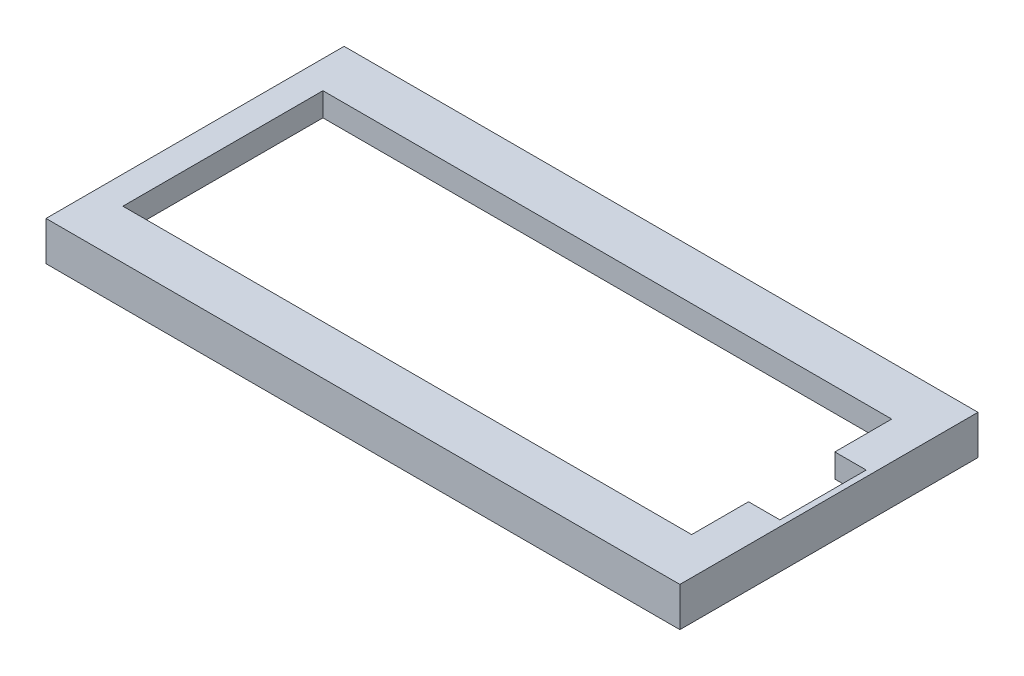
ISO-10303-21;
HEADER;
FILE_DESCRIPTION(('STEP AP214'),'2;1');
FILE_NAME('part.step','',(''),(''),'','','');
FILE_SCHEMA(('AUTOMOTIVE_DESIGN { 1 0 10303 214 1 1 1 1 }'));
ENDSEC;
DATA;
#1=APPLICATION_CONTEXT('core data for automotive mechanical design processes');
#2=APPLICATION_PROTOCOL_DEFINITION('international standard','automotive_design',2000,#1);
#3=PRODUCT_CONTEXT('',#1,'mechanical');
#4=PRODUCT('Part','Part','',(#3));
#5=PRODUCT_RELATED_PRODUCT_CATEGORY('part','',(#4));
#6=PRODUCT_DEFINITION_FORMATION('','',#4);
#7=PRODUCT_DEFINITION_CONTEXT('part definition',#1,'design');
#8=PRODUCT_DEFINITION('design','',#6,#7);
#9=PRODUCT_DEFINITION_SHAPE('','',#8);
#10=(LENGTH_UNIT() NAMED_UNIT(*) SI_UNIT(.MILLI.,.METRE.));
#11=(NAMED_UNIT(*) PLANE_ANGLE_UNIT() SI_UNIT($,.RADIAN.));
#12=(NAMED_UNIT(*) SI_UNIT($,.STERADIAN.) SOLID_ANGLE_UNIT());
#13=UNCERTAINTY_MEASURE_WITH_UNIT(LENGTH_MEASURE(1.E-05),#10,'distance_accuracy_value','');
#14=(GEOMETRIC_REPRESENTATION_CONTEXT(3) GLOBAL_UNCERTAINTY_ASSIGNED_CONTEXT((#13)) GLOBAL_UNIT_ASSIGNED_CONTEXT((#10,
#11,#12)) REPRESENTATION_CONTEXT('',''));
#15=CARTESIAN_POINT('',(0.,0.,0.));
#16=DIRECTION('',(0.,0.,1.));
#17=DIRECTION('',(1.,0.,0.));
#18=AXIS2_PLACEMENT_3D('',#15,#16,#17);
#19=CARTESIAN_POINT('',(0.,-2.,0.));
#20=DIRECTION('',(0.,1.,0.));
#21=DIRECTION('',(0.,0.,1.));
#22=AXIS2_PLACEMENT_3D('',#19,#20,#21);
#23=PLANE('',#22);
#24=DIRECTION('',(1.,0.,0.));
#25=VECTOR('',#24,1.);
#26=CARTESIAN_POINT('',(41.,-2.,19.));
#27=LINE('',#26,#25);
#28=CARTESIAN_POINT('',(-39.8,-2.,19.));
#29=VERTEX_POINT('',#28);
#30=CARTESIAN_POINT('',(41.,-2.,19.));
#31=VERTEX_POINT('',#30);
#32=EDGE_CURVE('E212',#29,#31,#27,.T.);
#33=ORIENTED_EDGE('',*,*,#32,.F.);
#34=DIRECTION('',(0.,0.,1.));
#35=VECTOR('',#34,1.);
#36=CARTESIAN_POINT('',(-39.8,-2.,-19.));
#37=LINE('',#36,#35);
#38=CARTESIAN_POINT('',(-39.8,-2.,18.25));
#39=VERTEX_POINT('',#38);
#40=EDGE_CURVE('E190',#39,#29,#37,.T.);
#41=ORIENTED_EDGE('',*,*,#40,.F.);
#42=DIRECTION('',(1.,0.,0.));
#43=VECTOR('',#42,1.);
#44=CARTESIAN_POINT('',(40.25,-2.,18.25));
#45=LINE('',#44,#43);
#46=CARTESIAN_POINT('',(40.25,-2.,18.25));
#47=VERTEX_POINT('',#46);
#48=EDGE_CURVE('E317',#39,#47,#45,.T.);
#49=ORIENTED_EDGE('',*,*,#48,.T.);
#50=DIRECTION('',(0.,0.,-1.));
#51=VECTOR('',#50,1.);
#52=CARTESIAN_POINT('',(40.25,-2.,18.25));
#53=LINE('',#52,#51);
#54=CARTESIAN_POINT('',(40.25,-2.,-18.25));
#55=VERTEX_POINT('',#54);
#56=EDGE_CURVE('E346',#47,#55,#53,.T.);
#57=ORIENTED_EDGE('',*,*,#56,.T.);
#58=DIRECTION('',(-1.,0.,0.));
#59=VECTOR('',#58,1.);
#60=CARTESIAN_POINT('',(40.25,-2.,-18.25));
#61=LINE('',#60,#59);
#62=CARTESIAN_POINT('',(6.00000000000001,-2.,-18.25));
#63=VERTEX_POINT('',#62);
#64=EDGE_CURVE('E335',#55,#63,#61,.T.);
#65=ORIENTED_EDGE('',*,*,#64,.T.);
#66=DIRECTION('',(0.,0.,1.));
#67=VECTOR('',#66,1.);
#68=CARTESIAN_POINT('',(6.00000000000001,-2.,-14.25));
#69=LINE('',#68,#67);
#70=CARTESIAN_POINT('',(6.00000000000001,-2.,-19.));
#71=VERTEX_POINT('',#70);
#72=EDGE_CURVE('E55',#71,#63,#69,.T.);
#73=ORIENTED_EDGE('',*,*,#72,.F.);
#74=DIRECTION('',(-1.,0.,0.));
#75=VECTOR('',#74,1.);
#76=CARTESIAN_POINT('',(41.,-2.,-19.));
#77=LINE('',#76,#75);
#78=CARTESIAN_POINT('',(41.,-2.,-19.));
#79=VERTEX_POINT('',#78);
#80=EDGE_CURVE('E206',#79,#71,#77,.T.);
#81=ORIENTED_EDGE('',*,*,#80,.F.);
#82=DIRECTION('',(0.,0.,-1.));
#83=VECTOR('',#82,1.);
#84=CARTESIAN_POINT('',(41.,-2.,19.));
#85=LINE('',#84,#83);
#86=EDGE_CURVE('E207',#31,#79,#85,.T.);
#87=ORIENTED_EDGE('',*,*,#86,.F.);
#88=EDGE_LOOP('',(#33,#41,#49,#57,#65,#73,#81,#87));
#89=FACE_BOUND('',#88,.T.);
#90=ADVANCED_FACE('F33',(#89),#23,.F.);
#91=CARTESIAN_POINT('',(41.5549280455494,0.,-5.5));
#92=DIRECTION('',(0.,0.,-1.));
#93=DIRECTION('',(-1.,0.,0.));
#94=AXIS2_PLACEMENT_3D('',#91,#92,#93);
#95=PLANE('',#94);
#96=DIRECTION('',(0.,-1.,0.));
#97=VECTOR('',#96,1.);
#98=CARTESIAN_POINT('',(40.25,3.,-5.50000000000001));
#99=LINE('',#98,#97);
#100=CARTESIAN_POINT('',(40.25,3.,-5.50000000000001));
#101=VERTEX_POINT('',#100);
#102=CARTESIAN_POINT('',(40.25,0.,-5.50000000000001));
#103=VERTEX_POINT('',#102);
#104=EDGE_CURVE('E341',#101,#103,#99,.T.);
#105=ORIENTED_EDGE('',*,*,#104,.F.);
#106=DIRECTION('',(-1.,0.,0.));
#107=VECTOR('',#106,1.);
#108=CARTESIAN_POINT('',(41.5549280455494,3.,-5.5));
#109=LINE('',#108,#107);
#110=CARTESIAN_POINT('',(36.25,3.,-5.5));
#111=VERTEX_POINT('',#110);
#112=EDGE_CURVE('E210',#101,#111,#109,.T.);
#113=ORIENTED_EDGE('',*,*,#112,.T.);
#114=DIRECTION('',(0.,1.,0.));
#115=VECTOR('',#114,1.);
#116=CARTESIAN_POINT('',(36.25,0.,-5.5));
#117=LINE('',#116,#115);
#118=CARTESIAN_POINT('',(36.25,0.,-5.5));
#119=VERTEX_POINT('',#118);
#120=EDGE_CURVE('E297',#119,#111,#117,.T.);
#121=ORIENTED_EDGE('',*,*,#120,.F.);
#122=DIRECTION('',(-1.,0.,0.));
#123=VECTOR('',#122,1.);
#124=CARTESIAN_POINT('',(41.5549280455494,0.,-5.5));
#125=LINE('',#124,#123);
#126=EDGE_CURVE('E216',#103,#119,#125,.T.);
#127=ORIENTED_EDGE('',*,*,#126,.F.);
#128=EDGE_LOOP('',(#105,#113,#121,#127));
#129=FACE_BOUND('',#128,.T.);
#130=ADVANCED_FACE('F384',(#129),#95,.F.);
#131=CARTESIAN_POINT('',(41.5549280455494,0.,5.5));
#132=DIRECTION('',(0.,0.,1.));
#133=DIRECTION('',(1.,0.,0.));
#134=AXIS2_PLACEMENT_3D('',#131,#132,#133);
#135=PLANE('',#134);
#136=DIRECTION('',(0.,-1.,0.));
#137=VECTOR('',#136,1.);
#138=CARTESIAN_POINT('',(40.25,3.,5.5));
#139=LINE('',#138,#137);
#140=CARTESIAN_POINT('',(40.25,3.,5.5));
#141=VERTEX_POINT('',#140);
#142=CARTESIAN_POINT('',(40.25,0.,5.5));
#143=VERTEX_POINT('',#142);
#144=EDGE_CURVE('E337',#141,#143,#139,.T.);
#145=ORIENTED_EDGE('',*,*,#144,.T.);
#146=DIRECTION('',(1.,0.,0.));
#147=VECTOR('',#146,1.);
#148=CARTESIAN_POINT('',(41.5549280455494,0.,5.5));
#149=LINE('',#148,#147);
#150=CARTESIAN_POINT('',(36.25,0.,5.5));
#151=VERTEX_POINT('',#150);
#152=EDGE_CURVE('E218',#151,#143,#149,.T.);
#153=ORIENTED_EDGE('',*,*,#152,.F.);
#154=DIRECTION('',(0.,-1.,0.));
#155=VECTOR('',#154,1.);
#156=CARTESIAN_POINT('',(36.25,0.,5.5));
#157=LINE('',#156,#155);
#158=CARTESIAN_POINT('',(36.25,3.,5.5));
#159=VERTEX_POINT('',#158);
#160=EDGE_CURVE('E300',#159,#151,#157,.T.);
#161=ORIENTED_EDGE('',*,*,#160,.F.);
#162=DIRECTION('',(1.,0.,0.));
#163=VECTOR('',#162,1.);
#164=CARTESIAN_POINT('',(41.5549280455494,3.,5.5));
#165=LINE('',#164,#163);
#166=EDGE_CURVE('E219',#159,#141,#165,.T.);
#167=ORIENTED_EDGE('',*,*,#166,.T.);
#168=EDGE_LOOP('',(#145,#153,#161,#167));
#169=FACE_BOUND('',#168,.T.);
#170=ADVANCED_FACE('F410',(#169),#135,.F.);
#171=CARTESIAN_POINT('',(41.,3.,-19.));
#172=DIRECTION('',(0.,0.,1.));
#173=DIRECTION('',(1.,0.,0.));
#174=AXIS2_PLACEMENT_3D('',#171,#172,#173);
#175=PLANE('',#174);
#176=CARTESIAN_POINT('',(-35.,-2.,-19.));
#177=VERTEX_POINT('',#176);
#178=CARTESIAN_POINT('',(-39.8,-2.,-19.));
#179=VERTEX_POINT('',#178);
#180=EDGE_CURVE('E197',#177,#179,#77,.T.);
#181=ORIENTED_EDGE('',*,*,#180,.T.);
#182=DIRECTION('',(0.,-1.,0.));
#183=VECTOR('',#182,1.);
#184=CARTESIAN_POINT('',(-39.8,-2.,-19.));
#185=LINE('',#184,#183);
#186=CARTESIAN_POINT('',(-39.8,3.,-19.));
#187=VERTEX_POINT('',#186);
#188=EDGE_CURVE('E179',#187,#179,#185,.T.);
#189=ORIENTED_EDGE('',*,*,#188,.F.);
#190=DIRECTION('',(-1.,0.,0.));
#191=VECTOR('',#190,1.);
#192=CARTESIAN_POINT('',(41.,3.,-19.));
#193=LINE('',#192,#191);
#194=CARTESIAN_POINT('',(41.,3.,-19.));
#195=VERTEX_POINT('',#194);
#196=EDGE_CURVE('E290',#195,#187,#193,.T.);
#197=ORIENTED_EDGE('',*,*,#196,.F.);
#198=DIRECTION('',(0.,-1.,0.));
#199=VECTOR('',#198,1.);
#200=CARTESIAN_POINT('',(41.,3.,-19.));
#201=LINE('',#200,#199);
#202=EDGE_CURVE('E292',#195,#79,#201,.T.);
#203=ORIENTED_EDGE('',*,*,#202,.T.);
#204=ORIENTED_EDGE('',*,*,#80,.T.);
#205=DIRECTION('',(0.,-1.,0.));
#206=VECTOR('',#205,1.);
#207=CARTESIAN_POINT('',(6.00000000000001,1.5,-19.));
#208=LINE('',#207,#206);
#209=CARTESIAN_POINT('',(6.00000000000001,1.5,-19.));
#210=VERTEX_POINT('',#209);
#211=EDGE_CURVE('E253',#210,#71,#208,.T.);
#212=ORIENTED_EDGE('',*,*,#211,.F.);
#213=DIRECTION('',(1.,0.,0.));
#214=VECTOR('',#213,1.);
#215=CARTESIAN_POINT('',(-35.,1.5,-19.));
#216=LINE('',#215,#214);
#217=CARTESIAN_POINT('',(-35.,1.5,-19.));
#218=VERTEX_POINT('',#217);
#219=EDGE_CURVE('E229',#218,#210,#216,.T.);
#220=ORIENTED_EDGE('',*,*,#219,.F.);
#221=DIRECTION('',(0.,-1.,0.));
#222=VECTOR('',#221,1.);
#223=CARTESIAN_POINT('',(-35.,1.5,-19.));
#224=LINE('',#223,#222);
#225=EDGE_CURVE('E204',#218,#177,#224,.T.);
#226=ORIENTED_EDGE('',*,*,#225,.T.);
#227=EDGE_LOOP('',(#181,#189,#197,#203,#204,#212,#220,#226));
#228=FACE_BOUND('',#227,.T.);
#229=ADVANCED_FACE('F202',(#228),#175,.F.);
#230=CARTESIAN_POINT('',(-35.,-2.,-18.25));
#231=VERTEX_POINT('',#230);
#232=CARTESIAN_POINT('',(-39.8,-2.,-18.25));
#233=VERTEX_POINT('',#232);
#234=EDGE_CURVE('E199',#231,#233,#61,.T.);
#235=ORIENTED_EDGE('',*,*,#234,.T.);
#236=EDGE_CURVE('E182',#179,#233,#37,.T.);
#237=ORIENTED_EDGE('',*,*,#236,.F.);
#238=ORIENTED_EDGE('',*,*,#180,.F.);
#239=DIRECTION('',(0.,0.,-1.));
#240=VECTOR('',#239,1.);
#241=CARTESIAN_POINT('',(-35.,-2.,-14.25));
#242=LINE('',#241,#240);
#243=EDGE_CURVE('E336',#231,#177,#242,.T.);
#244=ORIENTED_EDGE('',*,*,#243,.F.);
#245=EDGE_LOOP('',(#235,#237,#238,#244));
#246=FACE_BOUND('',#245,.T.);
#247=ADVANCED_FACE('F195',(#246),#23,.F.);
#248=CARTESIAN_POINT('',(40.25,-2.,-18.25));
#249=DIRECTION('',(0.,0.,-1.));
#250=DIRECTION('',(-1.,0.,0.));
#251=AXIS2_PLACEMENT_3D('',#248,#249,#250);
#252=PLANE('',#251);
#253=DIRECTION('',(0.,1.,0.));
#254=VECTOR('',#253,1.);
#255=CARTESIAN_POINT('',(6.00000000000001,-2.,-18.25));
#256=LINE('',#255,#254);
#257=CARTESIAN_POINT('',(6.00000000000001,0.,-18.25));
#258=VERTEX_POINT('',#257);
#259=EDGE_CURVE('E41',#63,#258,#256,.T.);
#260=ORIENTED_EDGE('',*,*,#259,.F.);
#261=ORIENTED_EDGE('',*,*,#64,.F.);
#262=DIRECTION('',(0.,1.,0.));
#263=VECTOR('',#262,1.);
#264=CARTESIAN_POINT('',(40.25,-2.,-18.25));
#265=LINE('',#264,#263);
#266=CARTESIAN_POINT('',(40.25,0.,-18.25));
#267=VERTEX_POINT('',#266);
#268=EDGE_CURVE('E314',#55,#267,#265,.T.);
#269=ORIENTED_EDGE('',*,*,#268,.T.);
#270=DIRECTION('',(-1.,0.,0.));
#271=VECTOR('',#270,1.);
#272=CARTESIAN_POINT('',(40.25,0.,-18.25));
#273=LINE('',#272,#271);
#274=EDGE_CURVE('E312',#267,#258,#273,.T.);
#275=ORIENTED_EDGE('',*,*,#274,.T.);
#276=EDGE_LOOP('',(#260,#261,#269,#275));
#277=FACE_BOUND('',#276,.T.);
#278=ADVANCED_FACE('F313',(#277),#252,.F.);
#279=CARTESIAN_POINT('',(-35.,0.,-18.25));
#280=VERTEX_POINT('',#279);
#281=CARTESIAN_POINT('',(-39.8,0.,-18.25));
#282=VERTEX_POINT('',#281);
#283=EDGE_CURVE('E318',#280,#282,#273,.T.);
#284=ORIENTED_EDGE('',*,*,#283,.T.);
#285=DIRECTION('',(0.,-1.,0.));
#286=VECTOR('',#285,1.);
#287=CARTESIAN_POINT('',(-39.8,-2.,-18.25));
#288=LINE('',#287,#286);
#289=EDGE_CURVE('E370',#282,#233,#288,.T.);
#290=ORIENTED_EDGE('',*,*,#289,.T.);
#291=ORIENTED_EDGE('',*,*,#234,.F.);
#292=DIRECTION('',(0.,-1.,0.));
#293=VECTOR('',#292,1.);
#294=CARTESIAN_POINT('',(-35.,-2.,-18.25));
#295=LINE('',#294,#293);
#296=EDGE_CURVE('E303',#280,#231,#295,.T.);
#297=ORIENTED_EDGE('',*,*,#296,.F.);
#298=EDGE_LOOP('',(#284,#290,#291,#297));
#299=FACE_BOUND('',#298,.T.);
#300=ADVANCED_FACE('F440',(#299),#252,.F.);
#301=CARTESIAN_POINT('',(36.25,0.,-12.75));
#302=DIRECTION('',(1.,0.,0.));
#303=DIRECTION('',(0.,0.,-1.));
#304=AXIS2_PLACEMENT_3D('',#301,#302,#303);
#305=PLANE('',#304);
#306=DIRECTION('',(0.,0.,-1.));
#307=VECTOR('',#306,1.);
#308=CARTESIAN_POINT('',(36.25,3.,-12.75));
#309=LINE('',#308,#307);
#310=CARTESIAN_POINT('',(36.25,3.,12.75));
#311=VERTEX_POINT('',#310);
#312=EDGE_CURVE('E272',#311,#159,#309,.T.);
#313=ORIENTED_EDGE('',*,*,#312,.T.);
#314=ORIENTED_EDGE('',*,*,#160,.T.);
#315=DIRECTION('',(0.,0.,-1.));
#316=VECTOR('',#315,1.);
#317=CARTESIAN_POINT('',(36.25,0.,-12.75));
#318=LINE('',#317,#316);
#319=CARTESIAN_POINT('',(36.25,0.,12.75));
#320=VERTEX_POINT('',#319);
#321=EDGE_CURVE('E262',#320,#151,#318,.T.);
#322=ORIENTED_EDGE('',*,*,#321,.F.);
#323=DIRECTION('',(0.,1.,0.));
#324=VECTOR('',#323,1.);
#325=CARTESIAN_POINT('',(36.25,0.,12.75));
#326=LINE('',#325,#324);
#327=EDGE_CURVE('E283',#320,#311,#326,.T.);
#328=ORIENTED_EDGE('',*,*,#327,.T.);
#329=EDGE_LOOP('',(#313,#314,#322,#328));
#330=FACE_BOUND('',#329,.T.);
#331=ADVANCED_FACE('F412',(#330),#305,.F.);
#332=CARTESIAN_POINT('',(41.,3.,19.));
#333=DIRECTION('',(0.,0.,-1.));
#334=DIRECTION('',(-1.,0.,0.));
#335=AXIS2_PLACEMENT_3D('',#332,#333,#334);
#336=PLANE('',#335);
#337=DIRECTION('',(1.,0.,0.));
#338=VECTOR('',#337,1.);
#339=CARTESIAN_POINT('',(41.,3.,19.));
#340=LINE('',#339,#338);
#341=CARTESIAN_POINT('',(-39.8,3.,19.));
#342=VERTEX_POINT('',#341);
#343=CARTESIAN_POINT('',(41.,3.,19.));
#344=VERTEX_POINT('',#343);
#345=EDGE_CURVE('E279',#342,#344,#340,.T.);
#346=ORIENTED_EDGE('',*,*,#345,.F.);
#347=DIRECTION('',(0.,1.,0.));
#348=VECTOR('',#347,1.);
#349=CARTESIAN_POINT('',(-39.8,-2.,19.));
#350=LINE('',#349,#348);
#351=EDGE_CURVE('E200',#29,#342,#350,.T.);
#352=ORIENTED_EDGE('',*,*,#351,.F.);
#353=ORIENTED_EDGE('',*,*,#32,.T.);
#354=DIRECTION('',(0.,-1.,0.));
#355=VECTOR('',#354,1.);
#356=CARTESIAN_POINT('',(41.,3.,19.));
#357=LINE('',#356,#355);
#358=EDGE_CURVE('E294',#344,#31,#357,.T.);
#359=ORIENTED_EDGE('',*,*,#358,.F.);
#360=EDGE_LOOP('',(#346,#352,#353,#359));
#361=FACE_BOUND('',#360,.T.);
#362=ADVANCED_FACE('F35',(#361),#336,.F.);
#363=CARTESIAN_POINT('',(41.,3.,19.));
#364=DIRECTION('',(-1.,0.,0.));
#365=DIRECTION('',(0.,0.,1.));
#366=AXIS2_PLACEMENT_3D('',#363,#364,#365);
#367=PLANE('',#366);
#368=ORIENTED_EDGE('',*,*,#202,.F.);
#369=DIRECTION('',(0.,0.,-1.));
#370=VECTOR('',#369,1.);
#371=CARTESIAN_POINT('',(41.,3.,19.));
#372=LINE('',#371,#370);
#373=EDGE_CURVE('E288',#344,#195,#372,.T.);
#374=ORIENTED_EDGE('',*,*,#373,.F.);
#375=ORIENTED_EDGE('',*,*,#358,.T.);
#376=ORIENTED_EDGE('',*,*,#86,.T.);
#377=EDGE_LOOP('',(#368,#374,#375,#376));
#378=FACE_BOUND('',#377,.T.);
#379=ADVANCED_FACE('F365',(#378),#367,.F.);
#380=CARTESIAN_POINT('',(0.,3.,0.));
#381=DIRECTION('',(0.,1.,0.));
#382=DIRECTION('',(0.,0.,1.));
#383=AXIS2_PLACEMENT_3D('',#380,#381,#382);
#384=PLANE('',#383);
#385=DIRECTION('',(0.,0.,-1.));
#386=VECTOR('',#385,1.);
#387=CARTESIAN_POINT('',(-39.8,3.,-19.));
#388=LINE('',#387,#386);
#389=EDGE_CURVE('E185',#342,#187,#388,.T.);
#390=ORIENTED_EDGE('',*,*,#389,.F.);
#391=ORIENTED_EDGE('',*,*,#345,.T.);
#392=ORIENTED_EDGE('',*,*,#373,.T.);
#393=ORIENTED_EDGE('',*,*,#196,.T.);
#394=EDGE_LOOP('',(#390,#391,#392,#393));
#395=FACE_BOUND('',#394,.T.);
#396=ORIENTED_EDGE('',*,*,#112,.F.);
#397=DIRECTION('',(0.,0.,1.));
#398=VECTOR('',#397,1.);
#399=CARTESIAN_POINT('',(40.25,3.,-5.50000000000001));
#400=LINE('',#399,#398);
#401=EDGE_CURVE('E375',#101,#141,#400,.T.);
#402=ORIENTED_EDGE('',*,*,#401,.T.);
#403=ORIENTED_EDGE('',*,*,#166,.F.);
#404=ORIENTED_EDGE('',*,*,#312,.F.);
#405=DIRECTION('',(1.,0.,0.));
#406=VECTOR('',#405,1.);
#407=CARTESIAN_POINT('',(36.25,3.,12.75));
#408=LINE('',#407,#406);
#409=CARTESIAN_POINT('',(-36.25,3.,12.75));
#410=VERTEX_POINT('',#409);
#411=EDGE_CURVE('E268',#410,#311,#408,.T.);
#412=ORIENTED_EDGE('',*,*,#411,.F.);
#413=DIRECTION('',(0.,0.,1.));
#414=VECTOR('',#413,1.);
#415=CARTESIAN_POINT('',(-36.25,3.,-12.75));
#416=LINE('',#415,#414);
#417=CARTESIAN_POINT('',(-36.25,3.,-12.75));
#418=VERTEX_POINT('',#417);
#419=EDGE_CURVE('E249',#418,#410,#416,.T.);
#420=ORIENTED_EDGE('',*,*,#419,.F.);
#421=DIRECTION('',(-1.,0.,0.));
#422=VECTOR('',#421,1.);
#423=CARTESIAN_POINT('',(36.25,3.,-12.75));
#424=LINE('',#423,#422);
#425=CARTESIAN_POINT('',(36.25,3.,-12.75));
#426=VERTEX_POINT('',#425);
#427=EDGE_CURVE('E259',#426,#418,#424,.T.);
#428=ORIENTED_EDGE('',*,*,#427,.F.);
#429=EDGE_CURVE('E271',#111,#426,#309,.T.);
#430=ORIENTED_EDGE('',*,*,#429,.F.);
#431=EDGE_LOOP('',(#396,#402,#403,#404,#412,#420,#428,#430));
#432=FACE_BOUND('',#431,.T.);
#433=ADVANCED_FACE('F367',(#395,#432),#384,.T.);
#434=CARTESIAN_POINT('',(-36.25,0.,-12.75));
#435=DIRECTION('',(-1.,0.,0.));
#436=DIRECTION('',(0.,0.,1.));
#437=AXIS2_PLACEMENT_3D('',#434,#435,#436);
#438=PLANE('',#437);
#439=ORIENTED_EDGE('',*,*,#419,.T.);
#440=DIRECTION('',(0.,1.,0.));
#441=VECTOR('',#440,1.);
#442=CARTESIAN_POINT('',(-36.25,0.,12.75));
#443=LINE('',#442,#441);
#444=CARTESIAN_POINT('',(-36.25,0.,12.75));
#445=VERTEX_POINT('',#444);
#446=EDGE_CURVE('E266',#445,#410,#443,.T.);
#447=ORIENTED_EDGE('',*,*,#446,.F.);
#448=DIRECTION('',(0.,0.,1.));
#449=VECTOR('',#448,1.);
#450=CARTESIAN_POINT('',(-36.25,0.,-12.75));
#451=LINE('',#450,#449);
#452=CARTESIAN_POINT('',(-36.25,0.,-12.75));
#453=VERTEX_POINT('',#452);
#454=EDGE_CURVE('E256',#453,#445,#451,.T.);
#455=ORIENTED_EDGE('',*,*,#454,.F.);
#456=DIRECTION('',(0.,1.,0.));
#457=VECTOR('',#456,1.);
#458=CARTESIAN_POINT('',(-36.25,0.,-12.75));
#459=LINE('',#458,#457);
#460=EDGE_CURVE('E277',#453,#418,#459,.T.);
#461=ORIENTED_EDGE('',*,*,#460,.T.);
#462=EDGE_LOOP('',(#439,#447,#455,#461));
#463=FACE_BOUND('',#462,.T.);
#464=ADVANCED_FACE('F399',(#463),#438,.F.);
#465=CARTESIAN_POINT('',(36.25,0.,-12.75));
#466=DIRECTION('',(0.,0.,-1.));
#467=DIRECTION('',(-1.,0.,0.));
#468=AXIS2_PLACEMENT_3D('',#465,#466,#467);
#469=PLANE('',#468);
#470=ORIENTED_EDGE('',*,*,#427,.T.);
#471=ORIENTED_EDGE('',*,*,#460,.F.);
#472=DIRECTION('',(-1.,0.,0.));
#473=VECTOR('',#472,1.);
#474=CARTESIAN_POINT('',(36.25,0.,-12.75));
#475=LINE('',#474,#473);
#476=CARTESIAN_POINT('',(36.25,0.,-12.75));
#477=VERTEX_POINT('',#476);
#478=EDGE_CURVE('E264',#477,#453,#475,.T.);
#479=ORIENTED_EDGE('',*,*,#478,.F.);
#480=DIRECTION('',(0.,1.,0.));
#481=VECTOR('',#480,1.);
#482=CARTESIAN_POINT('',(36.25,0.,-12.75));
#483=LINE('',#482,#481);
#484=EDGE_CURVE('E280',#477,#426,#483,.T.);
#485=ORIENTED_EDGE('',*,*,#484,.T.);
#486=EDGE_LOOP('',(#470,#471,#479,#485));
#487=FACE_BOUND('',#486,.T.);
#488=ADVANCED_FACE('F395',(#487),#469,.F.);
#489=EDGE_CURVE('E261',#119,#477,#318,.T.);
#490=ORIENTED_EDGE('',*,*,#489,.F.);
#491=ORIENTED_EDGE('',*,*,#120,.T.);
#492=ORIENTED_EDGE('',*,*,#429,.T.);
#493=ORIENTED_EDGE('',*,*,#484,.F.);
#494=EDGE_LOOP('',(#490,#491,#492,#493));
#495=FACE_BOUND('',#494,.T.);
#496=ADVANCED_FACE('F389',(#495),#305,.F.);
#497=CARTESIAN_POINT('',(36.25,0.,12.75));
#498=DIRECTION('',(0.,0.,1.));
#499=DIRECTION('',(1.,0.,0.));
#500=AXIS2_PLACEMENT_3D('',#497,#498,#499);
#501=PLANE('',#500);
#502=ORIENTED_EDGE('',*,*,#411,.T.);
#503=ORIENTED_EDGE('',*,*,#327,.F.);
#504=DIRECTION('',(1.,0.,0.));
#505=VECTOR('',#504,1.);
#506=CARTESIAN_POINT('',(36.25,0.,12.75));
#507=LINE('',#506,#505);
#508=EDGE_CURVE('E258',#445,#320,#507,.T.);
#509=ORIENTED_EDGE('',*,*,#508,.F.);
#510=ORIENTED_EDGE('',*,*,#446,.T.);
#511=EDGE_LOOP('',(#502,#503,#509,#510));
#512=FACE_BOUND('',#511,.T.);
#513=ADVANCED_FACE('F404',(#512),#501,.F.);
#514=CARTESIAN_POINT('',(-35.,1.5,-19.));
#515=DIRECTION('',(-1.,0.,0.));
#516=DIRECTION('',(0.,0.,1.));
#517=AXIS2_PLACEMENT_3D('',#514,#515,#516);
#518=PLANE('',#517);
#519=DIRECTION('',(0.,0.,-1.));
#520=VECTOR('',#519,1.);
#521=CARTESIAN_POINT('',(-35.,0.,-19.));
#522=LINE('',#521,#520);
#523=CARTESIAN_POINT('',(-35.,0.,-14.25));
#524=VERTEX_POINT('',#523);
#525=EDGE_CURVE('E222',#524,#280,#522,.T.);
#526=ORIENTED_EDGE('',*,*,#525,.T.);
#527=ORIENTED_EDGE('',*,*,#296,.T.);
#528=ORIENTED_EDGE('',*,*,#243,.T.);
#529=ORIENTED_EDGE('',*,*,#225,.F.);
#530=DIRECTION('',(0.,0.,-1.));
#531=VECTOR('',#530,1.);
#532=CARTESIAN_POINT('',(-35.,1.5,-19.));
#533=LINE('',#532,#531);
#534=CARTESIAN_POINT('',(-35.,1.5,-14.25));
#535=VERTEX_POINT('',#534);
#536=EDGE_CURVE('E226',#535,#218,#533,.T.);
#537=ORIENTED_EDGE('',*,*,#536,.F.);
#538=DIRECTION('',(0.,-1.,0.));
#539=VECTOR('',#538,1.);
#540=CARTESIAN_POINT('',(-35.,1.5,-14.25));
#541=LINE('',#540,#539);
#542=EDGE_CURVE('E246',#535,#524,#541,.T.);
#543=ORIENTED_EDGE('',*,*,#542,.T.);
#544=EDGE_LOOP('',(#526,#527,#528,#529,#537,#543));
#545=FACE_BOUND('',#544,.T.);
#546=ADVANCED_FACE('F468',(#545),#518,.F.);
#547=CARTESIAN_POINT('',(-35.,1.5,-14.25));
#548=DIRECTION('',(0.,0.,1.));
#549=DIRECTION('',(1.,0.,0.));
#550=AXIS2_PLACEMENT_3D('',#547,#548,#549);
#551=PLANE('',#550);
#552=DIRECTION('',(-1.,0.,0.));
#553=VECTOR('',#552,1.);
#554=CARTESIAN_POINT('',(-35.,0.,-14.25));
#555=LINE('',#554,#553);
#556=CARTESIAN_POINT('',(6.00000000000001,0.,-14.25));
#557=VERTEX_POINT('',#556);
#558=EDGE_CURVE('E230',#557,#524,#555,.T.);
#559=ORIENTED_EDGE('',*,*,#558,.T.);
#560=ORIENTED_EDGE('',*,*,#542,.F.);
#561=DIRECTION('',(-1.,0.,0.));
#562=VECTOR('',#561,1.);
#563=CARTESIAN_POINT('',(-35.,1.5,-14.25));
#564=LINE('',#563,#562);
#565=CARTESIAN_POINT('',(6.00000000000001,1.5,-14.25));
#566=VERTEX_POINT('',#565);
#567=EDGE_CURVE('E236',#566,#535,#564,.T.);
#568=ORIENTED_EDGE('',*,*,#567,.F.);
#569=DIRECTION('',(0.,-1.,0.));
#570=VECTOR('',#569,1.);
#571=CARTESIAN_POINT('',(6.00000000000001,1.5,-14.25));
#572=LINE('',#571,#570);
#573=EDGE_CURVE('E250',#566,#557,#572,.T.);
#574=ORIENTED_EDGE('',*,*,#573,.T.);
#575=EDGE_LOOP('',(#559,#560,#568,#574));
#576=FACE_BOUND('',#575,.T.);
#577=ADVANCED_FACE('F324',(#576),#551,.F.);
#578=CARTESIAN_POINT('',(6.00000000000001,1.5,-19.));
#579=DIRECTION('',(1.,0.,0.));
#580=DIRECTION('',(0.,0.,-1.));
#581=AXIS2_PLACEMENT_3D('',#578,#579,#580);
#582=PLANE('',#581);
#583=ORIENTED_EDGE('',*,*,#211,.T.);
#584=ORIENTED_EDGE('',*,*,#72,.T.);
#585=ORIENTED_EDGE('',*,*,#259,.T.);
#586=DIRECTION('',(0.,0.,1.));
#587=VECTOR('',#586,1.);
#588=CARTESIAN_POINT('',(6.00000000000001,0.,-19.));
#589=LINE('',#588,#587);
#590=EDGE_CURVE('E241',#258,#557,#589,.T.);
#591=ORIENTED_EDGE('',*,*,#590,.T.);
#592=ORIENTED_EDGE('',*,*,#573,.F.);
#593=DIRECTION('',(0.,0.,1.));
#594=VECTOR('',#593,1.);
#595=CARTESIAN_POINT('',(6.00000000000001,1.5,-19.));
#596=LINE('',#595,#594);
#597=EDGE_CURVE('E233',#210,#566,#596,.T.);
#598=ORIENTED_EDGE('',*,*,#597,.F.);
#599=EDGE_LOOP('',(#583,#584,#585,#591,#592,#598));
#600=FACE_BOUND('',#599,.T.);
#601=ADVANCED_FACE('F305',(#600),#582,.F.);
#602=CARTESIAN_POINT('',(0.,1.5,0.));
#603=DIRECTION('',(0.,1.,0.));
#604=DIRECTION('',(0.,0.,1.));
#605=AXIS2_PLACEMENT_3D('',#602,#603,#604);
#606=PLANE('',#605);
#607=ORIENTED_EDGE('',*,*,#536,.T.);
#608=ORIENTED_EDGE('',*,*,#219,.T.);
#609=ORIENTED_EDGE('',*,*,#597,.T.);
#610=ORIENTED_EDGE('',*,*,#567,.T.);
#611=EDGE_LOOP('',(#607,#608,#609,#610));
#612=FACE_BOUND('',#611,.T.);
#613=ADVANCED_FACE('F328',(#612),#606,.F.);
#614=CARTESIAN_POINT('',(0.,0.,0.));
#615=DIRECTION('',(0.,1.,0.));
#616=DIRECTION('',(0.,0.,1.));
#617=AXIS2_PLACEMENT_3D('',#614,#615,#616);
#618=PLANE('',#617);
#619=DIRECTION('',(1.,0.,0.));
#620=VECTOR('',#619,1.);
#621=CARTESIAN_POINT('',(40.25,0.,18.25));
#622=LINE('',#621,#620);
#623=CARTESIAN_POINT('',(-39.8,0.,18.25));
#624=VERTEX_POINT('',#623);
#625=CARTESIAN_POINT('',(40.25,0.,18.25));
#626=VERTEX_POINT('',#625);
#627=EDGE_CURVE('E339',#624,#626,#622,.T.);
#628=ORIENTED_EDGE('',*,*,#627,.F.);
#629=DIRECTION('',(0.,0.,-1.));
#630=VECTOR('',#629,1.);
#631=CARTESIAN_POINT('',(-39.8,0.,0.));
#632=LINE('',#631,#630);
#633=EDGE_CURVE('E48',#624,#282,#632,.T.);
#634=ORIENTED_EDGE('',*,*,#633,.T.);
#635=ORIENTED_EDGE('',*,*,#283,.F.);
#636=ORIENTED_EDGE('',*,*,#525,.F.);
#637=ORIENTED_EDGE('',*,*,#558,.F.);
#638=ORIENTED_EDGE('',*,*,#590,.F.);
#639=ORIENTED_EDGE('',*,*,#274,.F.);
#640=DIRECTION('',(0.,0.,-1.));
#641=VECTOR('',#640,1.);
#642=CARTESIAN_POINT('',(40.25,0.,18.25));
#643=LINE('',#642,#641);
#644=EDGE_CURVE('E351',#103,#267,#643,.T.);
#645=ORIENTED_EDGE('',*,*,#644,.F.);
#646=ORIENTED_EDGE('',*,*,#126,.T.);
#647=ORIENTED_EDGE('',*,*,#489,.T.);
#648=ORIENTED_EDGE('',*,*,#478,.T.);
#649=ORIENTED_EDGE('',*,*,#454,.T.);
#650=ORIENTED_EDGE('',*,*,#508,.T.);
#651=ORIENTED_EDGE('',*,*,#321,.T.);
#652=ORIENTED_EDGE('',*,*,#152,.T.);
#653=EDGE_CURVE('E352',#626,#143,#643,.T.);
#654=ORIENTED_EDGE('',*,*,#653,.F.);
#655=EDGE_LOOP('',(#628,#634,#635,#636,#637,#638,#639,#645,#646,#647,#648,#649,#650,#651,#652,#654));
#656=FACE_BOUND('',#655,.T.);
#657=ADVANCED_FACE('F321',(#656),#618,.F.);
#658=CARTESIAN_POINT('',(40.25,-2.,18.25));
#659=DIRECTION('',(1.,0.,0.));
#660=DIRECTION('',(0.,0.,-1.));
#661=AXIS2_PLACEMENT_3D('',#658,#659,#660);
#662=PLANE('',#661);
#663=ORIENTED_EDGE('',*,*,#653,.T.);
#664=ORIENTED_EDGE('',*,*,#144,.F.);
#665=ORIENTED_EDGE('',*,*,#401,.F.);
#666=ORIENTED_EDGE('',*,*,#104,.T.);
#667=ORIENTED_EDGE('',*,*,#644,.T.);
#668=ORIENTED_EDGE('',*,*,#268,.F.);
#669=ORIENTED_EDGE('',*,*,#56,.F.);
#670=DIRECTION('',(0.,1.,0.));
#671=VECTOR('',#670,1.);
#672=CARTESIAN_POINT('',(40.25,-2.,18.25));
#673=LINE('',#672,#671);
#674=EDGE_CURVE('E349',#47,#626,#673,.T.);
#675=ORIENTED_EDGE('',*,*,#674,.T.);
#676=EDGE_LOOP('',(#663,#664,#665,#666,#667,#668,#669,#675));
#677=FACE_BOUND('',#676,.T.);
#678=ADVANCED_FACE('F378',(#677),#662,.F.);
#679=CARTESIAN_POINT('',(40.25,-2.,18.25));
#680=DIRECTION('',(0.,0.,1.));
#681=DIRECTION('',(1.,0.,0.));
#682=AXIS2_PLACEMENT_3D('',#679,#680,#681);
#683=PLANE('',#682);
#684=ORIENTED_EDGE('',*,*,#48,.F.);
#685=DIRECTION('',(0.,1.,0.));
#686=VECTOR('',#685,1.);
#687=CARTESIAN_POINT('',(-39.8,-2.,18.25));
#688=LINE('',#687,#686);
#689=EDGE_CURVE('E11',#39,#624,#688,.T.);
#690=ORIENTED_EDGE('',*,*,#689,.T.);
#691=ORIENTED_EDGE('',*,*,#627,.T.);
#692=ORIENTED_EDGE('',*,*,#674,.F.);
#693=EDGE_LOOP('',(#684,#690,#691,#692));
#694=FACE_BOUND('',#693,.T.);
#695=ADVANCED_FACE('F419',(#694),#683,.F.);
#696=CARTESIAN_POINT('',(-39.8,0.,0.));
#697=DIRECTION('',(1.,0.,0.));
#698=DIRECTION('',(0.,0.,-1.));
#699=AXIS2_PLACEMENT_3D('',#696,#697,#698);
#700=PLANE('',#699);
#701=ORIENTED_EDGE('',*,*,#633,.F.);
#702=ORIENTED_EDGE('',*,*,#689,.F.);
#703=ORIENTED_EDGE('',*,*,#40,.T.);
#704=ORIENTED_EDGE('',*,*,#351,.T.);
#705=ORIENTED_EDGE('',*,*,#389,.T.);
#706=ORIENTED_EDGE('',*,*,#188,.T.);
#707=ORIENTED_EDGE('',*,*,#236,.T.);
#708=ORIENTED_EDGE('',*,*,#289,.F.);
#709=EDGE_LOOP('',(#701,#702,#703,#704,#705,#706,#707,#708));
#710=FACE_BOUND('',#709,.T.);
#711=ADVANCED_FACE('F181',(#710),#700,.F.);
#712=CLOSED_SHELL('',(#90,#130,#170,#229,#247,#278,#300,#331,#362,#379,#433,#464,#488,#496,#513,
#546,#577,#601,#613,#657,#678,#695,#711));
#713=MANIFOLD_SOLID_BREP('B2',#712);
#714=ADVANCED_BREP_SHAPE_REPRESENTATION('',(#18,#713),#14);
#715=SHAPE_DEFINITION_REPRESENTATION(#9,#714);
ENDSEC;
END-ISO-10303-21;
